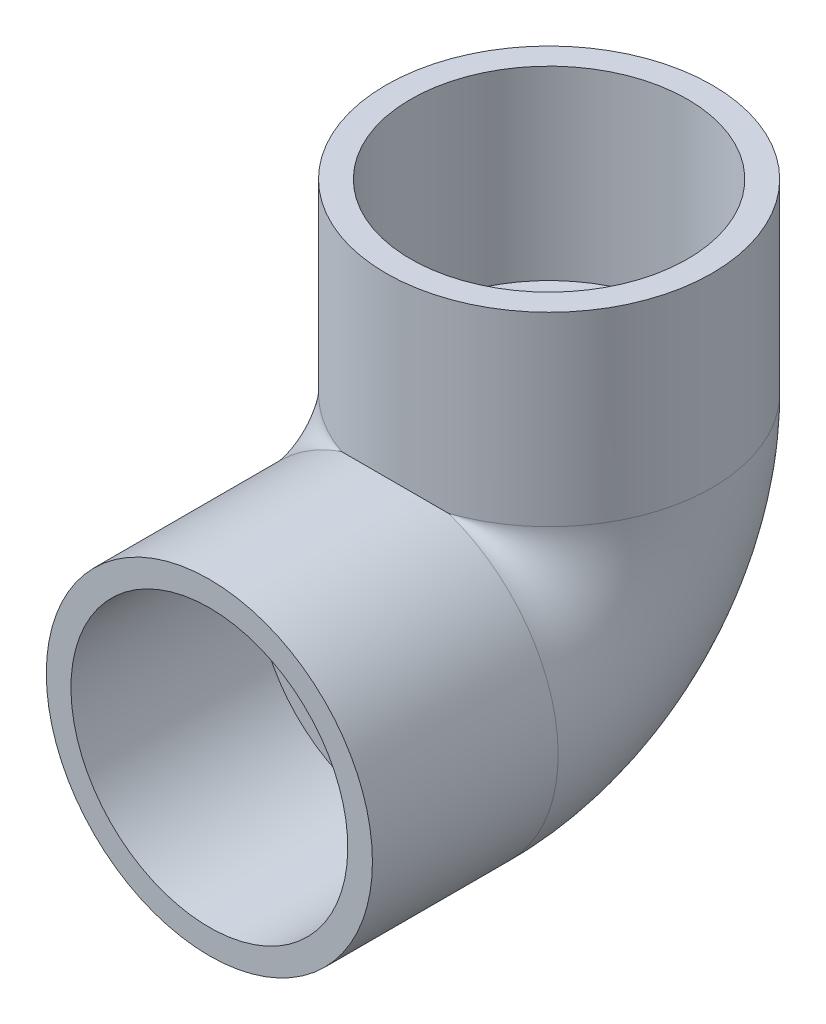
ISO-10303-21;
HEADER;
FILE_DESCRIPTION(('STEP AP214'),'2;1');
FILE_NAME('part.step','',(''),(''),'','','');
FILE_SCHEMA(('AUTOMOTIVE_DESIGN { 1 0 10303 214 1 1 1 1 }'));
ENDSEC;
DATA;
#1=APPLICATION_CONTEXT('core data for automotive mechanical design processes');
#2=APPLICATION_PROTOCOL_DEFINITION('international standard','automotive_design',2000,#1);
#3=PRODUCT_CONTEXT('',#1,'mechanical');
#4=PRODUCT('Part','Part','',(#3));
#5=PRODUCT_RELATED_PRODUCT_CATEGORY('part','',(#4));
#6=PRODUCT_DEFINITION_FORMATION('','',#4);
#7=PRODUCT_DEFINITION_CONTEXT('part definition',#1,'design');
#8=PRODUCT_DEFINITION('design','',#6,#7);
#9=PRODUCT_DEFINITION_SHAPE('','',#8);
#10=(LENGTH_UNIT() NAMED_UNIT(*) SI_UNIT(.MILLI.,.METRE.));
#11=(NAMED_UNIT(*) PLANE_ANGLE_UNIT() SI_UNIT($,.RADIAN.));
#12=(NAMED_UNIT(*) SI_UNIT($,.STERADIAN.) SOLID_ANGLE_UNIT());
#13=UNCERTAINTY_MEASURE_WITH_UNIT(LENGTH_MEASURE(1.E-05),#10,'distance_accuracy_value','');
#14=(GEOMETRIC_REPRESENTATION_CONTEXT(3) GLOBAL_UNCERTAINTY_ASSIGNED_CONTEXT((#13)) GLOBAL_UNIT_ASSIGNED_CONTEXT((#10,
#11,#12)) REPRESENTATION_CONTEXT('',''));
#15=CARTESIAN_POINT('',(0.,0.,0.));
#16=DIRECTION('',(0.,0.,1.));
#17=DIRECTION('',(1.,0.,0.));
#18=AXIS2_PLACEMENT_3D('',#15,#16,#17);
#19=CARTESIAN_POINT('',(0.,24.257,59.53125));
#20=DIRECTION('',(0.,0.,1.));
#21=DIRECTION('',(0.,-1.,0.));
#22=AXIS2_PLACEMENT_3D('',#19,#20,#21);
#23=PLANE('',#22);
#24=CARTESIAN_POINT('',(0.,0.,59.53125));
#25=DIRECTION('',(0.,0.,-1.));
#26=DIRECTION('',(0.,1.,0.));
#27=AXIS2_PLACEMENT_3D('',#24,#25,#26);
#28=CIRCLE('',#27,24.257);
#29=CARTESIAN_POINT('',(0.,24.257,59.53125));
#30=VERTEX_POINT('',#29);
#31=EDGE_CURVE('E125',#30,#30,#28,.T.);
#32=ORIENTED_EDGE('',*,*,#31,.T.);
#33=EDGE_LOOP('',(#32));
#34=FACE_BOUND('',#33,.T.);
#35=CARTESIAN_POINT('',(0.,0.,59.53125));
#36=DIRECTION('',(0.,0.,-1.));
#37=DIRECTION('',(0.,1.,0.));
#38=AXIS2_PLACEMENT_3D('',#35,#36,#37);
#39=CIRCLE('',#38,28.575);
#40=CARTESIAN_POINT('',(0.,28.575,59.53125));
#41=VERTEX_POINT('',#40);
#42=EDGE_CURVE('E11',#41,#41,#39,.T.);
#43=ORIENTED_EDGE('',*,*,#42,.F.);
#44=EDGE_LOOP('',(#43));
#45=FACE_BOUND('',#44,.T.);
#46=ADVANCED_FACE('F34',(#34,#45),#23,.T.);
#47=CARTESIAN_POINT('',(0.,0.,0.));
#48=DIRECTION('',(0.,0.,-1.));
#49=DIRECTION('',(0.,1.,0.));
#50=AXIS2_PLACEMENT_3D('',#47,#48,#49);
#51=CYLINDRICAL_SURFACE('',#50,28.575);
#52=CARTESIAN_POINT('',(0.,0.,0.));
#53=DIRECTION('',(0.,0.707106781186548,-0.707106781186547));
#54=DIRECTION('',(0.,-0.707106781186547,-0.707106781186548));
#55=AXIS2_PLACEMENT_3D('',#52,#53,#54);
#56=ELLIPSE('',#55,40.4111525448112,28.575);
#57=CARTESIAN_POINT('',(-9.39177665567056,26.9875,26.9875));
#58=VERTEX_POINT('',#57);
#59=CARTESIAN_POINT('',(9.39177665567064,26.9875,26.9875));
#60=VERTEX_POINT('',#59);
#61=EDGE_CURVE('E117',#58,#60,#56,.T.);
#62=ORIENTED_EDGE('',*,*,#61,.F.);
#63=CARTESIAN_POINT('',(9.39177665567063,26.9875,26.9875000000001));
#64=CARTESIAN_POINT('',(9.78628795367666,26.8502149085334,26.9875000000001));
#65=CARTESIAN_POINT('',(10.1777842951212,26.7042677271539,26.9875000000001));
#66=CARTESIAN_POINT('',(10.9540045193457,26.3953556378077,26.9875000000001));
#67=CARTESIAN_POINT('',(11.3387284021257,26.2323907298411,26.9875000000001));
#68=CARTESIAN_POINT('',(12.1006611634798,25.8897496405599,26.9875000000001));
#69=CARTESIAN_POINT('',(12.4778700420539,25.7100734592452,26.9875000000001));
#70=CARTESIAN_POINT('',(13.2240481896867,25.3343571792575,26.9875000000001));
#71=CARTESIAN_POINT('',(13.5930174587454,25.1383170805845,26.9875000000001));
#72=CARTESIAN_POINT('',(14.3220066911506,24.7302494389248,26.9875000000001));
#73=CARTESIAN_POINT('',(14.6820266544972,24.5182218959381,26.9875000000001));
#74=CARTESIAN_POINT('',(15.3924250386187,24.0785872108174,26.9875000000001));
#75=CARTESIAN_POINT('',(15.7428034593937,23.8509800686834,26.9875000000001));
#76=CARTESIAN_POINT('',(16.4332449943035,23.3806238200829,26.9875000000001));
#77=CARTESIAN_POINT('',(16.7733081084382,23.1378747136165,26.9875000000001));
#78=CARTESIAN_POINT('',(17.4424651195018,22.6377013331596,26.9875000000001));
#79=CARTESIAN_POINT('',(17.7715590164307,22.3802770591693,26.9875000000001));
#80=CARTESIAN_POINT('',(18.4181447706308,21.8512483475443,26.9875000000001));
#81=CARTESIAN_POINT('',(18.7356366279021,21.5796439099097,26.9875000000001));
#82=CARTESIAN_POINT('',(19.3584077914279,21.0227771454495,26.9875000000001));
#83=CARTESIAN_POINT('',(19.6636870976825,20.737514818624,26.9875000000001));
#84=CARTESIAN_POINT('',(20.2614461312355,20.1538808124026,26.9875000000001));
#85=CARTESIAN_POINT('',(20.5539258585341,19.8555091330066,26.9875000000001));
#86=CARTESIAN_POINT('',(21.1255233189025,19.2462301667417,26.9875000000001));
#87=CARTESIAN_POINT('',(21.4046410519724,18.9353228798727,26.9875000000001));
#88=CARTESIAN_POINT('',(21.9489778026401,18.3015705486746,26.9875000000001));
#89=CARTESIAN_POINT('',(22.2141968202379,17.9787255043454,26.9875000000001));
#90=CARTESIAN_POINT('',(22.7302261448509,17.3217184636162,26.9875000000001));
#91=CARTESIAN_POINT('',(22.981036451866,16.9875564672162,26.9875000000001));
#92=CARTESIAN_POINT('',(23.4677660670078,16.3085580893302,26.9875000000001));
#93=CARTESIAN_POINT('',(23.7036853751343,15.9637217078443,26.9875000000001));
#94=CARTESIAN_POINT('',(24.1601793384019,15.2640376527679,26.9875000000001));
#95=CARTESIAN_POINT('',(24.3807539935428,14.9091899791773,26.9875000000001));
#96=CARTESIAN_POINT('',(24.8061345032914,14.1901656837922,26.9875000000001));
#97=CARTESIAN_POINT('',(25.0109403578989,13.8259890619977,26.9875000000001));
#98=CARTESIAN_POINT('',(25.4043894411841,13.0890071529322,26.9875000000001));
#99=CARTESIAN_POINT('',(25.5930326698618,12.7162018656611,26.9875000000001));
#100=CARTESIAN_POINT('',(25.9537937553372,11.9626795006085,26.9875000000001));
#101=CARTESIAN_POINT('',(26.1259116121348,11.5819624228269,26.9875000000001));
#102=CARTESIAN_POINT('',(26.4532909848781,10.8133485654641,26.9875000000001));
#103=CARTESIAN_POINT('',(26.6085525008236,10.4254517858829,26.9875000000001));
#104=CARTESIAN_POINT('',(26.9019206362955,9.64322441962824,26.9875000000001));
#105=CARTESIAN_POINT('',(27.0400272558218,9.24889383295482,26.9875000000001));
#106=CARTESIAN_POINT('',(27.2988200303918,8.45455711892337,26.9875000000001));
#107=CARTESIAN_POINT('',(27.4195061854354,8.05455099156534,26.9875000000001));
#108=CARTESIAN_POINT('',(27.6432259611466,7.24963237618635,26.9875000000001));
#109=CARTESIAN_POINT('',(27.7462595818141,6.84471988816538,26.9875000000001));
#110=CARTESIAN_POINT('',(27.9344761633015,6.03076716602417,26.9875000000001));
#111=CARTESIAN_POINT('',(28.0196591241215,5.62172693190394,26.9875000000001));
#112=CARTESIAN_POINT('',(28.1720105858437,4.80030526945585,26.9875000000001));
#113=CARTESIAN_POINT('',(28.2391790867461,4.387923841128,26.9875000000001));
#114=CARTESIAN_POINT('',(28.3553724689393,3.56061276700751,26.9875000000001));
#115=CARTESIAN_POINT('',(28.4043973502301,3.14568312121487,26.9875000000001));
#116=CARTESIAN_POINT('',(28.4842092222463,2.31407348892747,26.9875000000001));
#117=CARTESIAN_POINT('',(28.5149962129716,1.89739350243272,26.9875000000001));
#118=CARTESIAN_POINT('',(28.558273102918,1.06308443126996,26.9875000000001));
#119=CARTESIAN_POINT('',(28.5707630021391,0.645455346601964,26.9875000000001));
#120=CARTESIAN_POINT('',(28.5774216919927,-0.189948853337995,26.9875000000001));
#121=CARTESIAN_POINT('',(28.5715904826251,-0.607723968609956,26.9875000000001));
#122=CARTESIAN_POINT('',(28.541618168254,-1.44261688138328,26.9875000000001));
#123=CARTESIAN_POINT('',(28.5174770632504,-1.85973467888465,26.9875000000001));
#124=CARTESIAN_POINT('',(28.4509313790352,-2.69251087171213,26.9875000000001));
#125=CARTESIAN_POINT('',(28.4085267998236,-3.10816926703824,26.9875000000001));
#126=CARTESIAN_POINT('',(28.3055357078313,-3.93722737742504,26.9875000000001));
#127=CARTESIAN_POINT('',(28.2449491950505,-4.35062709248572,26.9875000000001));
#128=CARTESIAN_POINT('',(28.1057107389733,-5.17437290751432,26.9875000000001));
#129=CARTESIAN_POINT('',(28.0270587956768,-5.58471900748222,26.9875000000001));
#130=CARTESIAN_POINT('',(27.8518407200099,-6.40156852935726,26.9875000000001));
#131=CARTESIAN_POINT('',(27.7552745876394,-6.80807195126439,26.9875000000001));
#132=CARTESIAN_POINT('',(27.5444138228297,-7.61645444321467,26.9875000000001));
#133=CARTESIAN_POINT('',(27.4301191903904,-8.01833351325782,26.9875000000001));
#134=CARTESIAN_POINT('',(27.1840212049458,-8.8166945199384,26.9875000000001));
#135=CARTESIAN_POINT('',(27.0522178519406,-9.21317645657582,26.9875000000001));
#136=CARTESIAN_POINT('',(26.7713558727466,-9.9999807931622,26.9875000000001));
#137=CARTESIAN_POINT('',(26.6222972465578,-10.3903031931111,26.9875000000001));
#138=CARTESIAN_POINT('',(26.3072113488994,-11.1640378973378,26.9875000000001));
#139=CARTESIAN_POINT('',(26.1411840774298,-11.5474502016155,26.9875000000001));
#140=CARTESIAN_POINT('',(25.7924801464697,-12.3066274430821,26.9875000000001));
#141=CARTESIAN_POINT('',(25.6098034869793,-12.6823923802711,26.9875000000001));
#142=CARTESIAN_POINT('',(25.2281520526892,-13.4255523214225,26.9875000000001));
#143=CARTESIAN_POINT('',(25.0291772778894,-13.7929473253849,26.9875000000001));
#144=CARTESIAN_POINT('',(24.6153122256734,-14.5186609286625,26.9875000000001));
#145=CARTESIAN_POINT('',(24.4004219482572,-14.8769795279777,26.9875000000001));
#146=CARTESIAN_POINT('',(23.9551391077491,-15.5838513037454,26.9875000000001));
#147=CARTESIAN_POINT('',(23.7247465446573,-15.9324044801979,26.9875000000001));
#148=CARTESIAN_POINT('',(23.2489021594032,-16.6190751701578,26.9875000000001));
#149=CARTESIAN_POINT('',(23.0034503372409,-16.9571926836652,26.9875000000001));
#150=CARTESIAN_POINT('',(22.4979594182107,-17.6223418746035,26.9875000000001));
#151=CARTESIAN_POINT('',(22.2379203213427,-17.9493735520344,26.9875000000001));
#152=CARTESIAN_POINT('',(21.7037548874367,-18.5917222148709,26.9875000000001));
#153=CARTESIAN_POINT('',(21.4296285503987,-18.9070392002766,26.9875000000001));
#154=CARTESIAN_POINT('',(20.8678157593326,-19.5253521495365,26.9875000000001));
#155=CARTESIAN_POINT('',(20.5801293053045,-19.8283481133907,26.9875000000001));
#156=CARTESIAN_POINT('',(19.9917494784666,-20.4214363823676,26.9875000000001));
#157=CARTESIAN_POINT('',(19.6910561056567,-20.7115286874904,26.9875000000001));
#158=CARTESIAN_POINT('',(19.0772406507355,-21.2782518145354,26.9875000000001));
#159=CARTESIAN_POINT('',(18.7641185686242,-21.5548826364578,26.9875000000001));
#160=CARTESIAN_POINT('',(18.1260478040014,-22.0941508579966,26.9875000000001));
#161=CARTESIAN_POINT('',(17.80109912149,-22.3567882576131,26.9875000000001));
#162=CARTESIAN_POINT('',(17.1400000065821,-22.8675646036744,26.9875000000001));
#163=CARTESIAN_POINT('',(16.8038495741855,-23.1157035501194,26.9875000000001));
#164=CARTESIAN_POINT('',(16.1209933500979,-23.5970058383465,26.9875000000001));
#165=CARTESIAN_POINT('',(15.7742875584067,-23.8301691801286,26.9875000000001));
#166=CARTESIAN_POINT('',(15.0709873034382,-24.2810719044374,26.9875000000001));
#167=CARTESIAN_POINT('',(14.7143928401608,-24.4988112869641,26.9875000000001));
#168=CARTESIAN_POINT('',(13.9920009448584,-24.9184473972183,26.9875000000001));
#169=CARTESIAN_POINT('',(13.6262035128334,-25.1203441249459,26.9875000000001));
#170=CARTESIAN_POINT('',(12.8861090794525,-25.5079066942254,26.9875000000001));
#171=CARTESIAN_POINT('',(12.5118120780967,-25.6935725357773,26.9875000000001));
#172=CARTESIAN_POINT('',(11.7554382494678,-26.0483163120346,26.9875000000001));
#173=CARTESIAN_POINT('',(11.3733614221948,-26.2173942467398,26.9875000000001));
#174=CARTESIAN_POINT('',(10.602162645133,-26.5386370858604,26.9875000000001));
#175=CARTESIAN_POINT('',(10.2130406953441,-26.6908019902756,26.9875000000001));
#176=CARTESIAN_POINT('',(9.42849992386299,-26.9779261677871,26.9875000000001));
#177=CARTESIAN_POINT('',(9.03308110217069,-27.1128854408833,26.9875000000001));
#178=CARTESIAN_POINT('',(8.23670694587978,-27.3653388397906,26.9875000000001));
#179=CARTESIAN_POINT('',(7.83575161128117,-27.4828329656017,26.9875000000001));
#180=CARTESIAN_POINT('',(7.02907543444947,-27.7001301380639,26.9875000000001));
#181=CARTESIAN_POINT('',(6.62335459221638,-27.7999331847151,26.9875000000001));
#182=CARTESIAN_POINT('',(5.80792756908034,-27.9816562855234,26.9875000000001));
#183=CARTESIAN_POINT('',(5.3982213881774,-28.0635763396806,26.9875000000001));
#184=CARTESIAN_POINT('',(4.57561152015611,-28.2093759297414,26.9875000000001));
#185=CARTESIAN_POINT('',(4.16270783303776,-28.273255465645,26.9875000000001));
#186=CARTESIAN_POINT('',(3.33449693359067,-28.3828511839232,26.9875000000001));
#187=CARTESIAN_POINT('',(2.91918972126192,-28.4285673662979,26.9875000000001));
#188=CARTESIAN_POINT('',(2.08697037418717,-28.5017484689294,26.9875000000001));
#189=CARTESIAN_POINT('',(1.67005823944117,-28.5292133891864,26.9875000000001));
#190=CARTESIAN_POINT('',(0.835430736463432,-28.5658391547217,26.9875000000001));
#191=CARTESIAN_POINT('',(0.417715368231697,-28.575,26.9875000000001));
#192=CARTESIAN_POINT('',(-0.417715368231773,-28.575,26.9875000000001));
#193=CARTESIAN_POINT('',(-0.835430736463508,-28.5658391547217,26.9875000000001));
#194=CARTESIAN_POINT('',(-1.67005823944124,-28.5292133891864,26.9875000000001));
#195=CARTESIAN_POINT('',(-2.08697037418725,-28.5017484689294,26.9875000000001));
#196=CARTESIAN_POINT('',(-2.91918972126199,-28.4285673662979,26.9875000000001));
#197=CARTESIAN_POINT('',(-3.33449693359074,-28.3828511839232,26.9875000000001));
#198=CARTESIAN_POINT('',(-4.16270783303784,-28.273255465645,26.9875000000001));
#199=CARTESIAN_POINT('',(-4.57561152015619,-28.2093759297414,26.9875000000001));
#200=CARTESIAN_POINT('',(-5.39822138817748,-28.0635763396806,26.9875000000001));
#201=CARTESIAN_POINT('',(-5.80792756908042,-27.9816562855234,26.9875000000001));
#202=CARTESIAN_POINT('',(-6.62335459221645,-27.7999331847151,26.9875000000001));
#203=CARTESIAN_POINT('',(-7.02907543444954,-27.7001301380639,26.9875000000001));
#204=CARTESIAN_POINT('',(-7.83575161128124,-27.4828329656016,26.9875000000001));
#205=CARTESIAN_POINT('',(-8.23670694587986,-27.3653388397906,26.9875000000001));
#206=CARTESIAN_POINT('',(-9.03308110217077,-27.1128854408833,26.9875000000001));
#207=CARTESIAN_POINT('',(-9.42849992386306,-26.9779261677871,26.9875000000001));
#208=CARTESIAN_POINT('',(-10.2130406953442,-26.6908019902756,26.9875000000001));
#209=CARTESIAN_POINT('',(-10.6021626451331,-26.5386370858603,26.9875000000001));
#210=CARTESIAN_POINT('',(-11.3733614221949,-26.2173942467398,26.9875000000001));
#211=CARTESIAN_POINT('',(-11.7554382494679,-26.0483163120345,26.9875000000001));
#212=CARTESIAN_POINT('',(-12.5118120780967,-25.6935725357773,26.9875000000001));
#213=CARTESIAN_POINT('',(-12.8861090794526,-25.5079066942253,26.9875000000001));
#214=CARTESIAN_POINT('',(-13.6262035128335,-25.1203441249459,26.9875000000001));
#215=CARTESIAN_POINT('',(-13.9920009448585,-24.9184473972183,26.9875000000001));
#216=CARTESIAN_POINT('',(-14.7143928401609,-24.4988112869641,26.9875000000001));
#217=CARTESIAN_POINT('',(-15.0709873034383,-24.2810719044374,26.9875000000001));
#218=CARTESIAN_POINT('',(-15.7742875584068,-23.8301691801286,26.9875000000001));
#219=CARTESIAN_POINT('',(-16.1209933500979,-23.5970058383464,26.9875000000001));
#220=CARTESIAN_POINT('',(-16.8038495741856,-23.1157035501193,26.9875000000001));
#221=CARTESIAN_POINT('',(-17.1400000065821,-22.8675646036744,26.9875000000001));
#222=CARTESIAN_POINT('',(-17.8010991214901,-22.356788257613,26.9875000000001));
#223=CARTESIAN_POINT('',(-18.1260478040015,-22.0941508579966,26.9875000000001));
#224=CARTESIAN_POINT('',(-18.7641185686242,-21.5548826364578,26.9875000000001));
#225=CARTESIAN_POINT('',(-19.0772406507356,-21.2782518145354,26.9875000000001));
#226=CARTESIAN_POINT('',(-19.6910561056568,-20.7115286874903,26.9875000000001));
#227=CARTESIAN_POINT('',(-19.9917494784666,-20.4214363823676,26.9875000000001));
#228=CARTESIAN_POINT('',(-20.5801293053046,-19.8283481133906,26.9875000000001));
#229=CARTESIAN_POINT('',(-20.8678157593326,-19.5253521495364,26.9875000000001));
#230=CARTESIAN_POINT('',(-21.4296285503987,-18.9070392002765,26.9875000000001));
#231=CARTESIAN_POINT('',(-21.7037548874367,-18.5917222148709,26.9875000000001));
#232=CARTESIAN_POINT('',(-22.2379203213427,-17.9493735520343,26.9875000000001));
#233=CARTESIAN_POINT('',(-22.4979594182107,-17.6223418746034,26.9875000000001));
#234=CARTESIAN_POINT('',(-23.0034503372409,-16.9571926836651,26.9875000000001));
#235=CARTESIAN_POINT('',(-23.2489021594032,-16.6190751701578,26.9875000000001));
#236=CARTESIAN_POINT('',(-23.7247465446573,-15.9324044801978,26.9875000000001));
#237=CARTESIAN_POINT('',(-23.9551391077492,-15.5838513037453,26.9875000000001));
#238=CARTESIAN_POINT('',(-24.4004219482572,-14.8769795279776,26.9875000000001));
#239=CARTESIAN_POINT('',(-24.6153122256734,-14.5186609286624,26.9875000000001));
#240=CARTESIAN_POINT('',(-25.0291772778894,-13.7929473253849,26.9875000000001));
#241=CARTESIAN_POINT('',(-25.2281520526892,-13.4255523214224,26.9875000000001));
#242=CARTESIAN_POINT('',(-25.6098034869794,-12.682392380271,26.9875000000001));
#243=CARTESIAN_POINT('',(-25.7924801464698,-12.306627443082,26.9875000000001));
#244=CARTESIAN_POINT('',(-26.1411840774298,-11.5474502016154,26.9875000000001));
#245=CARTESIAN_POINT('',(-26.3072113488995,-11.1640378973377,26.9875000000001));
#246=CARTESIAN_POINT('',(-26.6222972465579,-10.3903031931111,26.9875000000001));
#247=CARTESIAN_POINT('',(-26.7713558727466,-9.99998079316213,26.9875000000001));
#248=CARTESIAN_POINT('',(-27.0522178519406,-9.21317645657575,26.9875000000001));
#249=CARTESIAN_POINT('',(-27.1840212049459,-8.81669451993833,26.9875000000001));
#250=CARTESIAN_POINT('',(-27.4301191903904,-8.01833351325775,26.9875000000001));
#251=CARTESIAN_POINT('',(-27.5444138228297,-7.61645444321459,26.9875000000001));
#252=CARTESIAN_POINT('',(-27.7552745876395,-6.80807195126431,26.9875000000001));
#253=CARTESIAN_POINT('',(-27.8518407200099,-6.40156852935718,26.9875000000001));
#254=CARTESIAN_POINT('',(-28.0270587956768,-5.58471900748215,26.9875000000001));
#255=CARTESIAN_POINT('',(-28.1057107389733,-5.17437290751424,26.9875000000001));
#256=CARTESIAN_POINT('',(-28.2449491950506,-4.35062709248564,26.9875000000001));
#257=CARTESIAN_POINT('',(-28.3055357078313,-3.93722737742496,26.9875000000001));
#258=CARTESIAN_POINT('',(-28.4085267998236,-3.10816926703816,26.9875000000001));
#259=CARTESIAN_POINT('',(-28.4509313790352,-2.69251087171206,26.9875000000001));
#260=CARTESIAN_POINT('',(-28.5174770632504,-1.85973467888458,26.9875000000001));
#261=CARTESIAN_POINT('',(-28.541618168254,-1.44261688138321,26.9875000000001));
#262=CARTESIAN_POINT('',(-28.5715904826251,-0.607723968609884,26.9875000000001));
#263=CARTESIAN_POINT('',(-28.5774216919927,-0.189948853337921,26.9875000000001));
#264=CARTESIAN_POINT('',(-28.5707630021391,0.645455346602042,26.9875000000001));
#265=CARTESIAN_POINT('',(-28.558273102918,1.06308443127004,26.9875000000001));
#266=CARTESIAN_POINT('',(-28.5149962129716,1.8973935024328,26.9875000000001));
#267=CARTESIAN_POINT('',(-28.4842092222463,2.31407348892756,26.9875000000001));
#268=CARTESIAN_POINT('',(-28.4043973502301,3.14568312121495,26.9875000000001));
#269=CARTESIAN_POINT('',(-28.3553724689393,3.56061276700758,26.9875000000001));
#270=CARTESIAN_POINT('',(-28.2391790867461,4.38792384112807,26.9875000000001));
#271=CARTESIAN_POINT('',(-28.1720105858437,4.80030526945593,26.9875000000001));
#272=CARTESIAN_POINT('',(-28.0196591241214,5.62172693190402,26.9875000000001));
#273=CARTESIAN_POINT('',(-27.9344761633015,6.03076716602425,26.9875000000001));
#274=CARTESIAN_POINT('',(-27.7462595818141,6.84471988816545,26.9875000000001));
#275=CARTESIAN_POINT('',(-27.6432259611465,7.24963237618642,26.9875000000001));
#276=CARTESIAN_POINT('',(-27.4195061854354,8.05455099156542,26.9875000000001));
#277=CARTESIAN_POINT('',(-27.2988200303917,8.45455711892345,26.9875000000001));
#278=CARTESIAN_POINT('',(-27.0400272558218,9.2488938329549,26.9875000000001));
#279=CARTESIAN_POINT('',(-26.9019206362955,9.64322441962831,26.9875000000001));
#280=CARTESIAN_POINT('',(-26.6085525008236,10.4254517858829,26.9875000000001));
#281=CARTESIAN_POINT('',(-26.4532909848781,10.8133485654642,26.9875000000001));
#282=CARTESIAN_POINT('',(-26.1259116121348,11.581962422827,26.9875000000001));
#283=CARTESIAN_POINT('',(-25.9537937553371,11.9626795006086,26.9875000000001));
#284=CARTESIAN_POINT('',(-25.5930326698618,12.7162018656612,26.9875000000001));
#285=CARTESIAN_POINT('',(-25.4043894411841,13.0890071529322,26.9875000000001));
#286=CARTESIAN_POINT('',(-25.0109403578989,13.8259890619978,26.9875000000001));
#287=CARTESIAN_POINT('',(-24.8061345032913,14.1901656837923,26.9875000000001));
#288=CARTESIAN_POINT('',(-24.3807539935428,14.9091899791774,26.9875000000001));
#289=CARTESIAN_POINT('',(-24.1601793384018,15.2640376527679,26.9875000000001));
#290=CARTESIAN_POINT('',(-23.7036853751343,15.9637217078444,26.9875000000001));
#291=CARTESIAN_POINT('',(-23.4677660670077,16.3085580893303,26.9875000000001));
#292=CARTESIAN_POINT('',(-22.981036451866,16.9875564672162,26.9875000000001));
#293=CARTESIAN_POINT('',(-22.7302261448508,17.3217184636163,26.9875000000001));
#294=CARTESIAN_POINT('',(-22.2141968202378,17.9787255043455,26.9875000000001));
#295=CARTESIAN_POINT('',(-21.94897780264,18.3015705486747,26.9875000000001));
#296=CARTESIAN_POINT('',(-21.4046410519723,18.9353228798728,26.9875000000001));
#297=CARTESIAN_POINT('',(-21.1255233189024,19.2462301667418,26.9875000000001));
#298=CARTESIAN_POINT('',(-20.553925858534,19.8555091330067,26.9875000000001));
#299=CARTESIAN_POINT('',(-20.2614461312355,20.1538808124027,26.9875000000001));
#300=CARTESIAN_POINT('',(-19.6636870976824,20.7375148186241,26.9875000000001));
#301=CARTESIAN_POINT('',(-19.3584077914279,21.0227771454496,26.9875000000001));
#302=CARTESIAN_POINT('',(-18.735636627902,21.5796439099097,26.9875000000001));
#303=CARTESIAN_POINT('',(-18.4181447706307,21.8512483475443,26.9875000000001));
#304=CARTESIAN_POINT('',(-17.7715590164306,22.3802770591693,26.9875000000001));
#305=CARTESIAN_POINT('',(-17.4424651195017,22.6377013331597,26.9875000000001));
#306=CARTESIAN_POINT('',(-16.7733081084382,23.1378747136165,26.9875000000001));
#307=CARTESIAN_POINT('',(-16.4332449943034,23.380623820083,26.9875000000001));
#308=CARTESIAN_POINT('',(-15.7428034593937,23.8509800686835,26.9875000000001));
#309=CARTESIAN_POINT('',(-15.3924250386186,24.0785872108175,26.9875000000001));
#310=CARTESIAN_POINT('',(-14.6820266544971,24.5182218959382,26.9875000000001));
#311=CARTESIAN_POINT('',(-14.3220066911505,24.7302494389248,26.9875000000001));
#312=CARTESIAN_POINT('',(-13.5930174587453,25.1383170805845,26.9875000000001));
#313=CARTESIAN_POINT('',(-13.2240481896866,25.3343571792576,26.9875000000001));
#314=CARTESIAN_POINT('',(-12.4778700420538,25.7100734592453,26.9875000000001));
#315=CARTESIAN_POINT('',(-12.1006611634797,25.8897496405599,26.9875000000001));
#316=CARTESIAN_POINT('',(-11.3387284021256,26.2323907298411,26.9875000000001));
#317=CARTESIAN_POINT('',(-10.9540045193456,26.3953556378077,26.9875000000001));
#318=CARTESIAN_POINT('',(-10.1777842951211,26.7042677271539,26.9875000000001));
#319=CARTESIAN_POINT('',(-9.78628795367659,26.8502149085335,26.9875000000001));
#320=CARTESIAN_POINT('',(-9.39177665567056,26.9875,26.9875000000001));
#321=B_SPLINE_CURVE_WITH_KNOTS('',3,(#63,#64,#65,#66,#67,#68,#69,#70,#71,#72,#73,#74,#75,#76,
#77,#78,#79,#80,#81,#82,#83,#84,#85,#86,#87,#88,#89,#90,#91,#92,#93,#94,#95,#96,#97,#98,#99,
#100,#101,#102,#103,#104,#105,#106,#107,#108,#109,#110,#111,#112,#113,#114,#115,#116,#117,#118,
#119,#120,#121,#122,#123,#124,#125,#126,#127,#128,#129,#130,#131,#132,#133,#134,#135,#136,#137,
#138,#139,#140,#141,#142,#143,#144,#145,#146,#147,#148,#149,#150,#151,#152,#153,#154,#155,#156,
#157,#158,#159,#160,#161,#162,#163,#164,#165,#166,#167,#168,#169,#170,#171,#172,#173,#174,#175,
#176,#177,#178,#179,#180,#181,#182,#183,#184,#185,#186,#187,#188,#189,#190,#191,#192,#193,#194,
#195,#196,#197,#198,#199,#200,#201,#202,#203,#204,#205,#206,#207,#208,#209,#210,#211,#212,#213,
#214,#215,#216,#217,#218,#219,#220,#221,#222,#223,#224,#225,#226,#227,#228,#229,#230,#231,#232,
#233,#234,#235,#236,#237,#238,#239,#240,#241,#242,#243,#244,#245,#246,#247,#248,#249,#250,#251,
#252,#253,#254,#255,#256,#257,#258,#259,#260,#261,#262,#263,#264,#265,#266,#267,#268,#269,#270,
#271,#272,#273,#274,#275,#276,#277,#278,#279,#280,#281,#282,#283,#284,#285,#286,#287,#288,#289,
#290,#291,#292,#293,#294,#295,#296,#297,#298,#299,#300,#301,#302,#303,#304,#305,#306,#307,#308,
#309,#310,#311,#312,#313,#314,#315,#316,#317,#318,#319,#320),.UNSPECIFIED.,.F.,.F.,(4,2,2,2,2,2,
2,2,2,2,2,2,2,2,2,2,2,2,2,2,2,2,2,2,2,2,2,2,2,2,2,2,2,2,2,2,2,2,2,2,2,2,2,2,2,2,2,2,2,2,2,2,2,2,
2,2,2,2,2,2,2,2,2,2,2,2,2,2,2,2,2,2,2,2,2,2,2,2,2,2,2,2,2,2,2,2,2,2,2,2,2,2,2,2,2,2,2,2,2,2,2,2,
2,2,2,2,2,2,2,2,2,2,2,2,2,2,2,2,2,2,2,2,2,2,2,2,2,2,4),(0.,1.25304571258501,2.50609142517005,
3.75913713775505,5.01218285034009,6.26522856292511,7.51827427551014,8.77131998809515,
10.0243657006802,11.2774114132652,12.5304571258502,13.7835028384352,15.0365485510203,
16.2895942636053,17.5426399761903,18.7956856887753,20.0487314013604,21.3017771139454,
22.5548228265304,23.8078685391154,25.0609142517005,26.3139599642855,27.5670056768705,
28.8200513894555,30.0730971020405,31.3261428146256,32.5791885272106,33.8322342397956,
35.0852799523806,36.3383256649657,37.5913713775507,38.8444170901357,40.0974628027207,
41.3505085153057,42.6035542278908,43.8565999404758,45.1096456530608,46.3626913656458,
47.6157370782309,48.8687827908159,50.1218285034009,51.3748742159859,52.627919928571,
53.880965641156,55.134011353741,56.387057066326,57.640102778911,58.8931484914961,
60.1461942040811,61.3992399166661,62.6522856292511,63.9053313418362,65.1583770544212,
66.4114227670062,67.6644684795912,68.9175141921763,70.1705599047613,71.4236056173463,
72.6766513299313,73.9296970425164,75.1827427551014,76.4357884676864,77.6888341802714,
78.9418798928565,80.1949256054415,81.4479713180265,82.7010170306115,83.9540627431966,
85.2071084557816,86.4601541683666,87.7131998809516,88.9662455935367,90.2192913061217,
91.4723370187067,92.7253827312917,93.9784284438768,95.2314741564618,96.4845198690468,
97.7375655816318,98.9906112942169,100.243657006802,101.496702719387,102.749748431972,
104.002794144557,105.255839857142,106.508885569727,107.761931282312,109.014976994897,
110.268022707482,111.521068420067,112.774114132652,114.027159845237,115.280205557822,
116.533251270407,117.786296982992,119.039342695577,120.292388408162,121.545434120747,
122.798479833332,124.051525545917,125.304571258502,126.557616971087,127.810662683672,
129.063708396257,130.316754108842,131.569799821427,132.822845534012,134.075891246597,
135.328936959182,136.581982671768,137.835028384353,139.088074096938,140.341119809523,
141.594165522108,142.847211234693,144.100256947278,145.353302659863,146.606348372448,
147.859394085033,149.112439797618,150.365485510203,151.618531222788,152.871576935373,
154.124622647958,155.377668360543,156.630714073128,157.883759785713,159.136805498298,
160.389851210883),.UNSPECIFIED.);
#322=EDGE_CURVE('E42',#60,#58,#321,.T.);
#323=ORIENTED_EDGE('',*,*,#322,.F.);
#324=EDGE_LOOP('',(#62,#323));
#325=FACE_BOUND('',#324,.T.);
#326=ORIENTED_EDGE('',*,*,#42,.T.);
#327=EDGE_LOOP('',(#326));
#328=FACE_BOUND('',#327,.T.);
#329=ADVANCED_FACE('F107',(#325,#328),#51,.T.);
#330=CARTESIAN_POINT('',(0.,0.,0.));
#331=DIRECTION('',(0.,0.,-1.));
#332=DIRECTION('',(0.,1.,0.));
#333=AXIS2_PLACEMENT_3D('',#330,#331,#332);
#334=CYLINDRICAL_SURFACE('',#333,24.257);
#335=CARTESIAN_POINT('',(0.,0.,26.9875));
#336=DIRECTION('',(0.,0.,-1.));
#337=DIRECTION('',(0.,1.,0.));
#338=AXIS2_PLACEMENT_3D('',#335,#336,#337);
#339=CIRCLE('',#338,24.257);
#340=CARTESIAN_POINT('',(0.,24.257,26.9875));
#341=VERTEX_POINT('',#340);
#342=EDGE_CURVE('E65',#341,#341,#339,.T.);
#343=ORIENTED_EDGE('',*,*,#342,.T.);
#344=EDGE_LOOP('',(#343));
#345=FACE_BOUND('',#344,.T.);
#346=ORIENTED_EDGE('',*,*,#31,.F.);
#347=EDGE_LOOP('',(#346));
#348=FACE_BOUND('',#347,.T.);
#349=ADVANCED_FACE('F104',(#345,#348),#334,.F.);
#350=CARTESIAN_POINT('',(0.,59.53125,-24.257));
#351=DIRECTION('',(0.,1.,0.));
#352=DIRECTION('',(0.,0.,1.));
#353=AXIS2_PLACEMENT_3D('',#350,#351,#352);
#354=PLANE('',#353);
#355=CARTESIAN_POINT('',(0.,59.53125,0.));
#356=DIRECTION('',(0.,-1.,0.));
#357=DIRECTION('',(0.,0.,-1.));
#358=AXIS2_PLACEMENT_3D('',#355,#356,#357);
#359=CIRCLE('',#358,24.257);
#360=CARTESIAN_POINT('',(0.,59.53125,-24.257));
#361=VERTEX_POINT('',#360);
#362=EDGE_CURVE('E78',#361,#361,#359,.T.);
#363=ORIENTED_EDGE('',*,*,#362,.T.);
#364=EDGE_LOOP('',(#363));
#365=FACE_BOUND('',#364,.T.);
#366=CARTESIAN_POINT('',(0.,59.53125,0.));
#367=DIRECTION('',(0.,-1.,0.));
#368=DIRECTION('',(0.,0.,-1.));
#369=AXIS2_PLACEMENT_3D('',#366,#367,#368);
#370=CIRCLE('',#369,28.575);
#371=CARTESIAN_POINT('',(0.,59.53125,-28.575));
#372=VERTEX_POINT('',#371);
#373=EDGE_CURVE('E126',#372,#372,#370,.T.);
#374=ORIENTED_EDGE('',*,*,#373,.F.);
#375=EDGE_LOOP('',(#374));
#376=FACE_BOUND('',#375,.T.);
#377=ADVANCED_FACE('F100',(#365,#376),#354,.T.);
#378=CARTESIAN_POINT('',(0.,0.,0.));
#379=DIRECTION('',(0.,-1.,0.));
#380=DIRECTION('',(0.,0.,-1.));
#381=AXIS2_PLACEMENT_3D('',#378,#379,#380);
#382=CYLINDRICAL_SURFACE('',#381,28.575);
#383=ORIENTED_EDGE('',*,*,#373,.T.);
#384=EDGE_LOOP('',(#383));
#385=FACE_BOUND('',#384,.T.);
#386=CARTESIAN_POINT('',(0.,26.9875000000001,0.));
#387=DIRECTION('',(0.,-1.,0.));
#388=DIRECTION('',(0.,0.,-1.));
#389=AXIS2_PLACEMENT_3D('',#386,#387,#388);
#390=CIRCLE('',#389,28.575);
#391=EDGE_CURVE('E49',#58,#60,#390,.T.);
#392=ORIENTED_EDGE('',*,*,#391,.F.);
#393=ORIENTED_EDGE('',*,*,#61,.T.);
#394=EDGE_LOOP('',(#392,#393));
#395=FACE_BOUND('',#394,.T.);
#396=ADVANCED_FACE('F96',(#385,#395),#382,.T.);
#397=CARTESIAN_POINT('',(0.,0.,0.));
#398=DIRECTION('',(0.,-1.,0.));
#399=DIRECTION('',(0.,0.,-1.));
#400=AXIS2_PLACEMENT_3D('',#397,#398,#399);
#401=CYLINDRICAL_SURFACE('',#400,24.257);
#402=CARTESIAN_POINT('',(0.,26.9875,0.));
#403=DIRECTION('',(0.,-1.,0.));
#404=DIRECTION('',(0.,0.,-1.));
#405=AXIS2_PLACEMENT_3D('',#402,#403,#404);
#406=CIRCLE('',#405,24.257);
#407=CARTESIAN_POINT('',(0.,26.9875,-24.257));
#408=VERTEX_POINT('',#407);
#409=EDGE_CURVE('E69',#408,#408,#406,.T.);
#410=ORIENTED_EDGE('',*,*,#409,.T.);
#411=EDGE_LOOP('',(#410));
#412=FACE_BOUND('',#411,.T.);
#413=ORIENTED_EDGE('',*,*,#362,.F.);
#414=EDGE_LOOP('',(#413));
#415=FACE_BOUND('',#414,.T.);
#416=ADVANCED_FACE('F92',(#412,#415),#401,.F.);
#417=CARTESIAN_POINT('',(0.,26.9875000000001,26.9875000000001));
#418=DIRECTION('',(1.,0.,0.));
#419=DIRECTION('',(0.,0.,-1.));
#420=AXIS2_PLACEMENT_3D('',#417,#418,#419);
#421=TOROIDAL_SURFACE('',#420,26.9875000000001,20.2184);
#422=CARTESIAN_POINT('',(0.,26.9875000000001,0.));
#423=DIRECTION('',(0.,1.,0.));
#424=DIRECTION('',(0.,0.,1.));
#425=AXIS2_PLACEMENT_3D('',#422,#423,#424);
#426=CIRCLE('',#425,20.2184);
#427=CARTESIAN_POINT('',(0.,26.9875000000001,20.2184));
#428=VERTEX_POINT('',#427);
#429=EDGE_CURVE('E61',#428,#428,#426,.F.);
#430=ORIENTED_EDGE('',*,*,#429,.F.);
#431=EDGE_LOOP('',(#430));
#432=FACE_BOUND('',#431,.T.);
#433=CARTESIAN_POINT('',(0.,0.,26.9875));
#434=DIRECTION('',(0.,0.,-1.));
#435=DIRECTION('',(0.,1.,0.));
#436=AXIS2_PLACEMENT_3D('',#433,#434,#435);
#437=CIRCLE('',#436,20.2184);
#438=CARTESIAN_POINT('',(0.,20.2184,26.9875));
#439=VERTEX_POINT('',#438);
#440=EDGE_CURVE('E66',#439,#439,#437,.F.);
#441=ORIENTED_EDGE('',*,*,#440,.T.);
#442=EDGE_LOOP('',(#441));
#443=FACE_BOUND('',#442,.T.);
#444=ADVANCED_FACE('F95',(#432,#443),#421,.F.);
#445=CARTESIAN_POINT('',(0.,0.,26.9875));
#446=DIRECTION('',(0.,0.,-1.));
#447=DIRECTION('',(0.,1.,0.));
#448=AXIS2_PLACEMENT_3D('',#445,#446,#447);
#449=PLANE('',#448);
#450=ORIENTED_EDGE('',*,*,#342,.F.);
#451=EDGE_LOOP('',(#450));
#452=FACE_BOUND('',#451,.T.);
#453=ORIENTED_EDGE('',*,*,#440,.F.);
#454=EDGE_LOOP('',(#453));
#455=FACE_BOUND('',#454,.T.);
#456=ADVANCED_FACE('F90',(#452,#455),#449,.F.);
#457=CARTESIAN_POINT('',(0.,26.9875000000001,0.));
#458=DIRECTION('',(0.,1.,0.));
#459=DIRECTION('',(0.,0.,1.));
#460=AXIS2_PLACEMENT_3D('',#457,#458,#459);
#461=PLANE('',#460);
#462=ORIENTED_EDGE('',*,*,#429,.T.);
#463=EDGE_LOOP('',(#462));
#464=FACE_BOUND('',#463,.T.);
#465=ORIENTED_EDGE('',*,*,#409,.F.);
#466=EDGE_LOOP('',(#465));
#467=FACE_BOUND('',#466,.T.);
#468=ADVANCED_FACE('F62',(#464,#467),#461,.T.);
#469=CARTESIAN_POINT('',(0.,26.9875000000001,0.));
#470=DIRECTION('',(0.,-1.,0.));
#471=DIRECTION('',(0.,0.,-1.));
#472=AXIS2_PLACEMENT_3D('',#469,#470,#471);
#473=CIRCLE('',#472,28.575);
#474=TRIMMED_CURVE('',#473,(PARAMETER_VALUE(-2.80669649515042)),
(PARAMETER_VALUE(2.80669649515042)),.T.,.PARAMETER.);
#475=CARTESIAN_POINT('',(0.,26.9875000000001,26.9875000000001));
#476=DIRECTION('',(1.,0.,0.));
#477=AXIS1_PLACEMENT('',#475,#476);
#478=SURFACE_OF_REVOLUTION('',#474,#477);
#479=ORIENTED_EDGE('',*,*,#322,.T.);
#480=ORIENTED_EDGE('',*,*,#391,.T.);
#481=EDGE_LOOP('',(#479,#480));
#482=FACE_BOUND('',#481,.T.);
#483=ADVANCED_FACE('F80',(#482),#478,.T.);
#484=CLOSED_SHELL('',(#46,#329,#349,#377,#396,#416,#444,#456,#468,#483));
#485=MANIFOLD_SOLID_BREP('B2',#484);
#486=ADVANCED_BREP_SHAPE_REPRESENTATION('',(#18,#485),#14);
#487=SHAPE_DEFINITION_REPRESENTATION(#9,#486);
ENDSEC;
END-ISO-10303-21;
